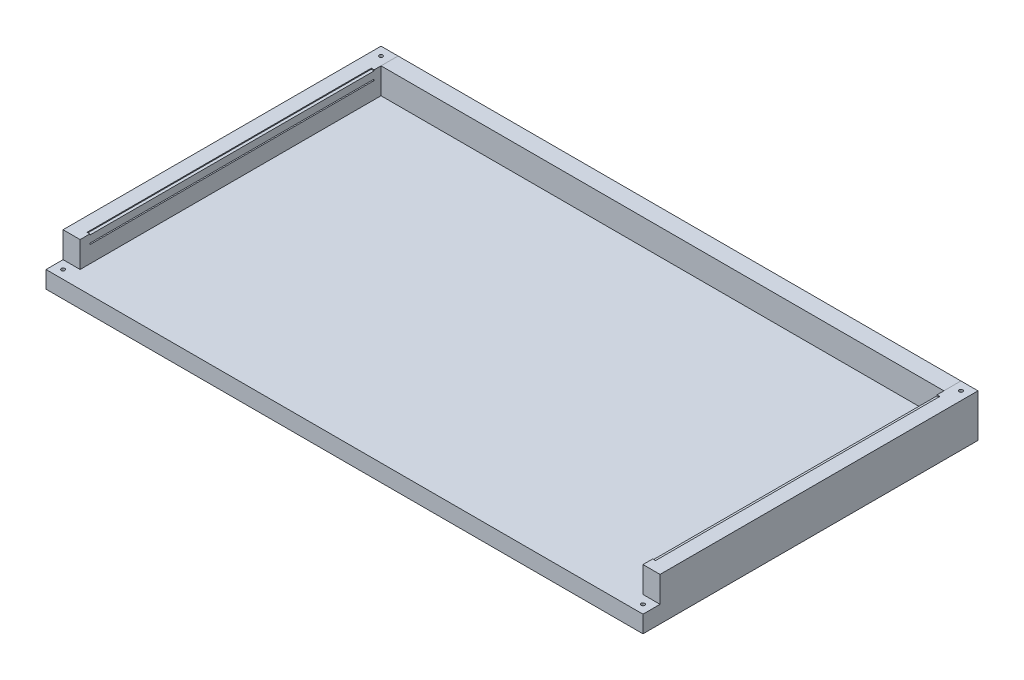
ISO-10303-21;
HEADER;
FILE_DESCRIPTION(('STEP AP214'),'2;1');
FILE_NAME('part.step','',(''),(''),'','','');
FILE_SCHEMA(('AUTOMOTIVE_DESIGN { 1 0 10303 214 1 1 1 1 }'));
ENDSEC;
DATA;
#1=APPLICATION_CONTEXT('core data for automotive mechanical design processes');
#2=APPLICATION_PROTOCOL_DEFINITION('international standard','automotive_design',2000,#1);
#3=PRODUCT_CONTEXT('',#1,'mechanical');
#4=PRODUCT('Part','Part','',(#3));
#5=PRODUCT_RELATED_PRODUCT_CATEGORY('part','',(#4));
#6=PRODUCT_DEFINITION_FORMATION('','',#4);
#7=PRODUCT_DEFINITION_CONTEXT('part definition',#1,'design');
#8=PRODUCT_DEFINITION('design','',#6,#7);
#9=PRODUCT_DEFINITION_SHAPE('','',#8);
#10=(LENGTH_UNIT() NAMED_UNIT(*) SI_UNIT(.MILLI.,.METRE.));
#11=(NAMED_UNIT(*) PLANE_ANGLE_UNIT() SI_UNIT($,.RADIAN.));
#12=(NAMED_UNIT(*) SI_UNIT($,.STERADIAN.) SOLID_ANGLE_UNIT());
#13=UNCERTAINTY_MEASURE_WITH_UNIT(LENGTH_MEASURE(1.E-05),#10,'distance_accuracy_value','');
#14=(GEOMETRIC_REPRESENTATION_CONTEXT(3) GLOBAL_UNCERTAINTY_ASSIGNED_CONTEXT((#13)) GLOBAL_UNIT_ASSIGNED_CONTEXT((#10,
#11,#12)) REPRESENTATION_CONTEXT('',''));
#15=CARTESIAN_POINT('',(0.,0.,0.));
#16=DIRECTION('',(0.,0.,1.));
#17=DIRECTION('',(1.,0.,0.));
#18=AXIS2_PLACEMENT_3D('',#15,#16,#17);
#19=CARTESIAN_POINT('',(-1050.,2132.1088823063,-499.25));
#20=DIRECTION('',(0.,0.,1.));
#21=DIRECTION('',(1.,0.,0.));
#22=AXIS2_PLACEMENT_3D('',#19,#20,#21);
#23=PLANE('',#22);
#24=DIRECTION('',(1.,0.,0.));
#25=VECTOR('',#24,1.);
#26=CARTESIAN_POINT('',(-1050.,151.2,-499.25));
#27=LINE('',#26,#25);
#28=CARTESIAN_POINT('',(-990.,151.2,-499.25));
#29=VERTEX_POINT('',#28);
#30=CARTESIAN_POINT('',(990.,151.2,-499.25));
#31=VERTEX_POINT('',#30);
#32=EDGE_CURVE('E52',#29,#31,#27,.T.);
#33=ORIENTED_EDGE('',*,*,#32,.F.);
#34=DIRECTION('',(0.,-1.,0.));
#35=VECTOR('',#34,1.);
#36=CARTESIAN_POINT('',(-990.,2132.1088823063,-499.25));
#37=LINE('',#36,#35);
#38=CARTESIAN_POINT('',(-990.,0.,-499.25));
#39=VERTEX_POINT('',#38);
#40=EDGE_CURVE('E80',#29,#39,#37,.T.);
#41=ORIENTED_EDGE('',*,*,#40,.T.);
#42=DIRECTION('',(-1.,0.,0.));
#43=VECTOR('',#42,1.);
#44=CARTESIAN_POINT('',(-1050.,0.,-499.25));
#45=LINE('',#44,#43);
#46=CARTESIAN_POINT('',(990.,0.,-499.25));
#47=VERTEX_POINT('',#46);
#48=EDGE_CURVE('E84',#47,#39,#45,.T.);
#49=ORIENTED_EDGE('',*,*,#48,.F.);
#50=DIRECTION('',(0.,-1.,0.));
#51=VECTOR('',#50,1.);
#52=CARTESIAN_POINT('',(990.,2132.1088823063,-499.25));
#53=LINE('',#52,#51);
#54=EDGE_CURVE('E107',#31,#47,#53,.T.);
#55=ORIENTED_EDGE('',*,*,#54,.F.);
#56=EDGE_LOOP('',(#33,#41,#49,#55));
#57=FACE_BOUND('',#56,.T.);
#58=ADVANCED_FACE('F44',(#57),#23,.T.);
#59=CARTESIAN_POINT('',(989.999999999996,2132.1088823063,559.250000000008));
#60=DIRECTION('',(1.,0.,0.));
#61=DIRECTION('',(0.,0.,-1.));
#62=AXIS2_PLACEMENT_3D('',#59,#60,#61);
#63=PLANE('',#62);
#64=DIRECTION('',(0.,0.,-1.));
#65=VECTOR('',#64,1.);
#66=CARTESIAN_POINT('',(989.999999999996,151.2,559.250000000008));
#67=LINE('',#66,#65);
#68=CARTESIAN_POINT('',(990.,151.2,-559.25));
#69=VERTEX_POINT('',#68);
#70=EDGE_CURVE('E58',#31,#69,#67,.T.);
#71=ORIENTED_EDGE('',*,*,#70,.F.);
#72=ORIENTED_EDGE('',*,*,#54,.T.);
#73=DIRECTION('',(0.,0.,1.));
#74=VECTOR('',#73,1.);
#75=CARTESIAN_POINT('',(989.999999999996,0.,559.250000000008));
#76=LINE('',#75,#74);
#77=CARTESIAN_POINT('',(990.,0.,-559.25));
#78=VERTEX_POINT('',#77);
#79=EDGE_CURVE('E89',#78,#47,#76,.T.);
#80=ORIENTED_EDGE('',*,*,#79,.F.);
#81=DIRECTION('',(0.,-1.,0.));
#82=VECTOR('',#81,1.);
#83=CARTESIAN_POINT('',(990.,2132.1088823063,-559.25));
#84=LINE('',#83,#82);
#85=EDGE_CURVE('E110',#69,#78,#84,.T.);
#86=ORIENTED_EDGE('',*,*,#85,.F.);
#87=EDGE_LOOP('',(#71,#72,#80,#86));
#88=FACE_BOUND('',#87,.T.);
#89=ADVANCED_FACE('F116',(#88),#63,.T.);
#90=CARTESIAN_POINT('',(-1050.,2132.1088823063,-559.25));
#91=DIRECTION('',(0.,0.,-1.));
#92=DIRECTION('',(-1.,0.,0.));
#93=AXIS2_PLACEMENT_3D('',#90,#91,#92);
#94=PLANE('',#93);
#95=DIRECTION('',(-1.,0.,0.));
#96=VECTOR('',#95,1.);
#97=CARTESIAN_POINT('',(-1050.,151.2,-559.25));
#98=LINE('',#97,#96);
#99=CARTESIAN_POINT('',(-990.,151.2,-559.25));
#100=VERTEX_POINT('',#99);
#101=EDGE_CURVE('E109',#69,#100,#98,.T.);
#102=ORIENTED_EDGE('',*,*,#101,.F.);
#103=ORIENTED_EDGE('',*,*,#85,.T.);
#104=DIRECTION('',(1.,0.,0.));
#105=VECTOR('',#104,1.);
#106=CARTESIAN_POINT('',(-1050.,0.,-559.25));
#107=LINE('',#106,#105);
#108=CARTESIAN_POINT('',(-990.,0.,-559.25));
#109=VERTEX_POINT('',#108);
#110=EDGE_CURVE('E97',#109,#78,#107,.T.);
#111=ORIENTED_EDGE('',*,*,#110,.F.);
#112=DIRECTION('',(0.,-1.,0.));
#113=VECTOR('',#112,1.);
#114=CARTESIAN_POINT('',(-990.,2132.1088823063,-559.25));
#115=LINE('',#114,#113);
#116=EDGE_CURVE('E88',#100,#109,#115,.T.);
#117=ORIENTED_EDGE('',*,*,#116,.F.);
#118=EDGE_LOOP('',(#102,#103,#111,#117));
#119=FACE_BOUND('',#118,.T.);
#120=ADVANCED_FACE('F114',(#119),#94,.T.);
#121=CARTESIAN_POINT('',(-990.,2132.1088823063,559.25));
#122=DIRECTION('',(-1.,0.,0.));
#123=DIRECTION('',(0.,0.,1.));
#124=AXIS2_PLACEMENT_3D('',#121,#122,#123);
#125=PLANE('',#124);
#126=DIRECTION('',(0.,0.,1.));
#127=VECTOR('',#126,1.);
#128=CARTESIAN_POINT('',(-990.,151.2,559.25));
#129=LINE('',#128,#127);
#130=EDGE_CURVE('E12',#100,#29,#129,.T.);
#131=ORIENTED_EDGE('',*,*,#130,.F.);
#132=ORIENTED_EDGE('',*,*,#116,.T.);
#133=DIRECTION('',(0.,0.,-1.));
#134=VECTOR('',#133,1.);
#135=CARTESIAN_POINT('',(-990.,0.,559.25));
#136=LINE('',#135,#134);
#137=EDGE_CURVE('E91',#39,#109,#136,.T.);
#138=ORIENTED_EDGE('',*,*,#137,.F.);
#139=ORIENTED_EDGE('',*,*,#40,.F.);
#140=EDGE_LOOP('',(#131,#132,#138,#139));
#141=FACE_BOUND('',#140,.T.);
#142=ADVANCED_FACE('F92',(#141),#125,.T.);
#143=CARTESIAN_POINT('',(0.,0.,0.));
#144=DIRECTION('',(0.,-1.,0.));
#145=DIRECTION('',(0.,0.,-1.));
#146=AXIS2_PLACEMENT_3D('',#143,#144,#145);
#147=PLANE('',#146);
#148=ORIENTED_EDGE('',*,*,#48,.T.);
#149=ORIENTED_EDGE('',*,*,#137,.T.);
#150=ORIENTED_EDGE('',*,*,#110,.T.);
#151=ORIENTED_EDGE('',*,*,#79,.T.);
#152=EDGE_LOOP('',(#148,#149,#150,#151));
#153=FACE_BOUND('',#152,.T.);
#154=ADVANCED_FACE('F99',(#153),#147,.T.);
#155=CARTESIAN_POINT('',(-1050.,151.2,559.25));
#156=DIRECTION('',(0.,-1.,0.));
#157=DIRECTION('',(0.,0.,-1.));
#158=AXIS2_PLACEMENT_3D('',#155,#156,#157);
#159=PLANE('',#158);
#160=ORIENTED_EDGE('',*,*,#32,.T.);
#161=ORIENTED_EDGE('',*,*,#70,.T.);
#162=ORIENTED_EDGE('',*,*,#101,.T.);
#163=ORIENTED_EDGE('',*,*,#130,.T.);
#164=EDGE_LOOP('',(#160,#161,#162,#163));
#165=FACE_BOUND('',#164,.T.);
#166=ADVANCED_FACE('F118',(#165),#159,.F.);
#167=CLOSED_SHELL('',(#58,#89,#120,#142,#154,#166));
#168=MANIFOLD_SOLID_BREP('B2',#167);
#169=CARTESIAN_POINT('',(0.,0.,559.25));
#170=DIRECTION('',(0.,0.,1.));
#171=DIRECTION('',(1.,0.,0.));
#172=AXIS2_PLACEMENT_3D('',#169,#170,#171);
#173=PLANE('',#172);
#174=DIRECTION('',(-1.,0.,0.));
#175=VECTOR('',#174,1.);
#176=CARTESIAN_POINT('',(-1050.,60.0000000000001,559.25));
#177=LINE('',#176,#175);
#178=CARTESIAN_POINT('',(1050.,60.0000000000001,559.25));
#179=VERTEX_POINT('',#178);
#180=CARTESIAN_POINT('',(990.,60.,559.25));
#181=VERTEX_POINT('',#180);
#182=EDGE_CURVE('E177',#179,#181,#177,.T.);
#183=ORIENTED_EDGE('',*,*,#182,.F.);
#184=DIRECTION('',(0.,1.,0.));
#185=VECTOR('',#184,1.);
#186=CARTESIAN_POINT('',(1050.,151.2,559.25));
#187=LINE('',#186,#185);
#188=CARTESIAN_POINT('',(1050.,151.2,559.25));
#189=VERTEX_POINT('',#188);
#190=EDGE_CURVE('E486',#179,#189,#187,.T.);
#191=ORIENTED_EDGE('',*,*,#190,.T.);
#192=DIRECTION('',(-1.,0.,0.));
#193=VECTOR('',#192,1.);
#194=CARTESIAN_POINT('',(1050.,151.2,559.25));
#195=LINE('',#194,#193);
#196=CARTESIAN_POINT('',(990.,151.2,559.25));
#197=VERTEX_POINT('',#196);
#198=EDGE_CURVE('E488',#189,#197,#195,.T.);
#199=ORIENTED_EDGE('',*,*,#198,.T.);
#200=DIRECTION('',(0.,-1.,0.));
#201=VECTOR('',#200,1.);
#202=CARTESIAN_POINT('',(990.,151.2,559.25));
#203=LINE('',#202,#201);
#204=EDGE_CURVE('E490',#197,#181,#203,.T.);
#205=ORIENTED_EDGE('',*,*,#204,.T.);
#206=EDGE_LOOP('',(#183,#191,#199,#205));
#207=FACE_BOUND('',#206,.T.);
#208=ADVANCED_FACE('F167',(#207),#173,.T.);
#209=CARTESIAN_POINT('',(1050.,151.2,559.25));
#210=DIRECTION('',(0.,-1.,0.));
#211=DIRECTION('',(0.,0.,-1.));
#212=AXIS2_PLACEMENT_3D('',#209,#210,#211);
#213=PLANE('',#212);
#214=CARTESIAN_POINT('',(1020.,151.2,-529.25));
#215=DIRECTION('',(0.,-1.,0.));
#216=DIRECTION('',(0.,0.,-1.));
#217=AXIS2_PLACEMENT_3D('',#214,#215,#216);
#218=CIRCLE('',#217,6.35000000000015);
#219=CARTESIAN_POINT('',(1020.,151.2,-535.6));
#220=VERTEX_POINT('',#219);
#221=EDGE_CURVE('E382',#220,#220,#218,.T.);
#222=ORIENTED_EDGE('',*,*,#221,.T.);
#223=EDGE_LOOP('',(#222));
#224=FACE_BOUND('',#223,.T.);
#225=DIRECTION('',(-1.,0.,0.));
#226=VECTOR('',#225,1.);
#227=CARTESIAN_POINT('',(1000.,151.2,-475.));
#228=LINE('',#227,#226);
#229=CARTESIAN_POINT('',(1000.,151.2,-475.));
#230=VERTEX_POINT('',#229);
#231=CARTESIAN_POINT('',(990.,151.2,-475.));
#232=VERTEX_POINT('',#231);
#233=EDGE_CURVE('E401',#230,#232,#228,.T.);
#234=ORIENTED_EDGE('',*,*,#233,.F.);
#235=DIRECTION('',(0.,0.,1.));
#236=VECTOR('',#235,1.);
#237=CARTESIAN_POINT('',(1000.,151.2,-475.));
#238=LINE('',#237,#236);
#239=CARTESIAN_POINT('',(1000.,151.2,525.));
#240=VERTEX_POINT('',#239);
#241=EDGE_CURVE('E419',#230,#240,#238,.T.);
#242=ORIENTED_EDGE('',*,*,#241,.T.);
#243=DIRECTION('',(-1.,0.,0.));
#244=VECTOR('',#243,1.);
#245=CARTESIAN_POINT('',(1000.,151.2,525.));
#246=LINE('',#245,#244);
#247=CARTESIAN_POINT('',(990.,151.2,525.));
#248=VERTEX_POINT('',#247);
#249=EDGE_CURVE('E394',#240,#248,#246,.T.);
#250=ORIENTED_EDGE('',*,*,#249,.T.);
#251=DIRECTION('',(0.,0.,-1.));
#252=VECTOR('',#251,1.);
#253=CARTESIAN_POINT('',(990.,151.2,559.25));
#254=LINE('',#253,#252);
#255=EDGE_CURVE('E528',#197,#248,#254,.T.);
#256=ORIENTED_EDGE('',*,*,#255,.F.);
#257=ORIENTED_EDGE('',*,*,#198,.F.);
#258=DIRECTION('',(0.,0.,-1.));
#259=VECTOR('',#258,1.);
#260=CARTESIAN_POINT('',(1050.,151.2,559.25));
#261=LINE('',#260,#259);
#262=CARTESIAN_POINT('',(1050.,151.2,-559.25));
#263=VERTEX_POINT('',#262);
#264=EDGE_CURVE('E531',#189,#263,#261,.T.);
#265=ORIENTED_EDGE('',*,*,#264,.T.);
#266=DIRECTION('',(-1.,0.,0.));
#267=VECTOR('',#266,1.);
#268=CARTESIAN_POINT('',(1050.,151.2,-559.25));
#269=LINE('',#268,#267);
#270=CARTESIAN_POINT('',(990.,151.2,-559.25));
#271=VERTEX_POINT('',#270);
#272=EDGE_CURVE('E498',#263,#271,#269,.T.);
#273=ORIENTED_EDGE('',*,*,#272,.T.);
#274=EDGE_CURVE('E527',#232,#271,#254,.T.);
#275=ORIENTED_EDGE('',*,*,#274,.F.);
#276=EDGE_LOOP('',(#234,#242,#250,#256,#257,#265,#273,#275));
#277=FACE_BOUND('',#276,.T.);
#278=ADVANCED_FACE('F586',(#224,#277),#213,.F.);
#279=CARTESIAN_POINT('',(990.,151.2,559.25));
#280=DIRECTION('',(1.,0.,0.));
#281=DIRECTION('',(0.,1.,0.));
#282=AXIS2_PLACEMENT_3D('',#279,#280,#281);
#283=PLANE('',#282);
#284=DIRECTION('',(0.,0.,-1.));
#285=VECTOR('',#284,1.);
#286=CARTESIAN_POINT('',(990.,118.5,559.25));
#287=LINE('',#286,#285);
#288=CARTESIAN_POINT('',(990.,118.5,525.));
#289=VERTEX_POINT('',#288);
#290=CARTESIAN_POINT('',(990.,118.5,-475.));
#291=VERTEX_POINT('',#290);
#292=EDGE_CURVE('E476',#289,#291,#287,.T.);
#293=ORIENTED_EDGE('',*,*,#292,.T.);
#294=DIRECTION('',(0.,1.,0.));
#295=VECTOR('',#294,1.);
#296=CARTESIAN_POINT('',(990.,151.2,-475.));
#297=LINE('',#296,#295);
#298=CARTESIAN_POINT('',(990.,122.9,-475.));
#299=VERTEX_POINT('',#298);
#300=EDGE_CURVE('E473',#291,#299,#297,.T.);
#301=ORIENTED_EDGE('',*,*,#300,.T.);
#302=DIRECTION('',(0.,0.,1.));
#303=VECTOR('',#302,1.);
#304=CARTESIAN_POINT('',(990.,122.9,559.25));
#305=LINE('',#304,#303);
#306=CARTESIAN_POINT('',(990.,122.9,525.));
#307=VERTEX_POINT('',#306);
#308=EDGE_CURVE('E479',#299,#307,#305,.T.);
#309=ORIENTED_EDGE('',*,*,#308,.T.);
#310=DIRECTION('',(0.,1.,0.));
#311=VECTOR('',#310,1.);
#312=CARTESIAN_POINT('',(990.,151.2,525.));
#313=LINE('',#312,#311);
#314=EDGE_CURVE('E471',#289,#307,#313,.T.);
#315=ORIENTED_EDGE('',*,*,#314,.F.);
#316=EDGE_LOOP('',(#293,#301,#309,#315));
#317=FACE_BOUND('',#316,.T.);
#318=DIRECTION('',(0.,-1.,0.));
#319=VECTOR('',#318,1.);
#320=CARTESIAN_POINT('',(990.,151.2,-475.));
#321=LINE('',#320,#319);
#322=CARTESIAN_POINT('',(990.,147.9,-475.));
#323=VERTEX_POINT('',#322);
#324=EDGE_CURVE('E469',#232,#323,#321,.T.);
#325=ORIENTED_EDGE('',*,*,#324,.F.);
#326=ORIENTED_EDGE('',*,*,#274,.T.);
#327=DIRECTION('',(0.,-1.,0.));
#328=VECTOR('',#327,1.);
#329=CARTESIAN_POINT('',(990.,151.2,-559.25));
#330=LINE('',#329,#328);
#331=CARTESIAN_POINT('',(990.,60.,-559.25));
#332=VERTEX_POINT('',#331);
#333=EDGE_CURVE('E501',#271,#332,#330,.T.);
#334=ORIENTED_EDGE('',*,*,#333,.T.);
#335=DIRECTION('',(0.,0.,-1.));
#336=VECTOR('',#335,1.);
#337=CARTESIAN_POINT('',(990.,60.,559.25));
#338=LINE('',#337,#336);
#339=EDGE_CURVE('E524',#181,#332,#338,.T.);
#340=ORIENTED_EDGE('',*,*,#339,.F.);
#341=ORIENTED_EDGE('',*,*,#204,.F.);
#342=ORIENTED_EDGE('',*,*,#255,.T.);
#343=DIRECTION('',(0.,-1.,0.));
#344=VECTOR('',#343,1.);
#345=CARTESIAN_POINT('',(990.,151.2,525.));
#346=LINE('',#345,#344);
#347=CARTESIAN_POINT('',(990.,147.9,525.));
#348=VERTEX_POINT('',#347);
#349=EDGE_CURVE('E464',#248,#348,#346,.T.);
#350=ORIENTED_EDGE('',*,*,#349,.T.);
#351=DIRECTION('',(0.,0.,-1.));
#352=VECTOR('',#351,1.);
#353=CARTESIAN_POINT('',(990.,147.9,559.25));
#354=LINE('',#353,#352);
#355=EDGE_CURVE('E482',#348,#323,#354,.T.);
#356=ORIENTED_EDGE('',*,*,#355,.T.);
#357=EDGE_LOOP('',(#325,#326,#334,#340,#341,#342,#350,#356));
#358=FACE_BOUND('',#357,.T.);
#359=ADVANCED_FACE('F592',(#317,#358),#283,.F.);
#360=CARTESIAN_POINT('',(-990.,151.2,559.25));
#361=DIRECTION('',(-1.,0.,0.));
#362=DIRECTION('',(0.,-1.,0.));
#363=AXIS2_PLACEMENT_3D('',#360,#361,#362);
#364=PLANE('',#363);
#365=DIRECTION('',(0.,0.,-1.));
#366=VECTOR('',#365,1.);
#367=CARTESIAN_POINT('',(-990.,122.9,559.25));
#368=LINE('',#367,#366);
#369=CARTESIAN_POINT('',(-990.,122.9,525.));
#370=VERTEX_POINT('',#369);
#371=CARTESIAN_POINT('',(-990.,122.9,-475.));
#372=VERTEX_POINT('',#371);
#373=EDGE_CURVE('E544',#370,#372,#368,.T.);
#374=ORIENTED_EDGE('',*,*,#373,.T.);
#375=DIRECTION('',(0.,-1.,0.));
#376=VECTOR('',#375,1.);
#377=CARTESIAN_POINT('',(-990.,151.2,-475.));
#378=LINE('',#377,#376);
#379=CARTESIAN_POINT('',(-990.,118.5,-475.));
#380=VERTEX_POINT('',#379);
#381=EDGE_CURVE('E546',#372,#380,#378,.T.);
#382=ORIENTED_EDGE('',*,*,#381,.T.);
#383=DIRECTION('',(0.,0.,1.));
#384=VECTOR('',#383,1.);
#385=CARTESIAN_POINT('',(-990.,118.5,559.25));
#386=LINE('',#385,#384);
#387=CARTESIAN_POINT('',(-990.,118.5,525.));
#388=VERTEX_POINT('',#387);
#389=EDGE_CURVE('E541',#380,#388,#386,.T.);
#390=ORIENTED_EDGE('',*,*,#389,.T.);
#391=DIRECTION('',(0.,-1.,0.));
#392=VECTOR('',#391,1.);
#393=CARTESIAN_POINT('',(-990.,151.2,525.));
#394=LINE('',#393,#392);
#395=EDGE_CURVE('E539',#370,#388,#394,.T.);
#396=ORIENTED_EDGE('',*,*,#395,.F.);
#397=EDGE_LOOP('',(#374,#382,#390,#396));
#398=FACE_BOUND('',#397,.T.);
#399=DIRECTION('',(0.,1.,0.));
#400=VECTOR('',#399,1.);
#401=CARTESIAN_POINT('',(-990.,151.2,-475.));
#402=LINE('',#401,#400);
#403=CARTESIAN_POINT('',(-990.,147.9,-475.));
#404=VERTEX_POINT('',#403);
#405=CARTESIAN_POINT('',(-990.,151.2,-475.));
#406=VERTEX_POINT('',#405);
#407=EDGE_CURVE('E467',#404,#406,#402,.T.);
#408=ORIENTED_EDGE('',*,*,#407,.F.);
#409=DIRECTION('',(0.,0.,1.));
#410=VECTOR('',#409,1.);
#411=CARTESIAN_POINT('',(-990.,147.9,559.25));
#412=LINE('',#411,#410);
#413=CARTESIAN_POINT('',(-990.,147.9,525.));
#414=VERTEX_POINT('',#413);
#415=EDGE_CURVE('E171',#404,#414,#412,.T.);
#416=ORIENTED_EDGE('',*,*,#415,.T.);
#417=DIRECTION('',(0.,1.,0.));
#418=VECTOR('',#417,1.);
#419=CARTESIAN_POINT('',(-990.,151.2,525.));
#420=LINE('',#419,#418);
#421=CARTESIAN_POINT('',(-990.,151.2,525.));
#422=VERTEX_POINT('',#421);
#423=EDGE_CURVE('E418',#414,#422,#420,.T.);
#424=ORIENTED_EDGE('',*,*,#423,.T.);
#425=DIRECTION('',(0.,0.,-1.));
#426=VECTOR('',#425,1.);
#427=CARTESIAN_POINT('',(-990.,151.2,559.25));
#428=LINE('',#427,#426);
#429=CARTESIAN_POINT('',(-990.,151.2,559.25));
#430=VERTEX_POINT('',#429);
#431=EDGE_CURVE('E518',#430,#422,#428,.T.);
#432=ORIENTED_EDGE('',*,*,#431,.F.);
#433=DIRECTION('',(0.,1.,0.));
#434=VECTOR('',#433,1.);
#435=CARTESIAN_POINT('',(-990.,151.2,559.25));
#436=LINE('',#435,#434);
#437=CARTESIAN_POINT('',(-990.,60.,559.25));
#438=VERTEX_POINT('',#437);
#439=EDGE_CURVE('E492',#438,#430,#436,.T.);
#440=ORIENTED_EDGE('',*,*,#439,.F.);
#441=DIRECTION('',(0.,0.,-1.));
#442=VECTOR('',#441,1.);
#443=CARTESIAN_POINT('',(-990.,60.,559.25));
#444=LINE('',#443,#442);
#445=CARTESIAN_POINT('',(-990.,60.,-559.25));
#446=VERTEX_POINT('',#445);
#447=EDGE_CURVE('E521',#438,#446,#444,.T.);
#448=ORIENTED_EDGE('',*,*,#447,.T.);
#449=DIRECTION('',(0.,1.,0.));
#450=VECTOR('',#449,1.);
#451=CARTESIAN_POINT('',(-990.,151.2,-559.25));
#452=LINE('',#451,#450);
#453=CARTESIAN_POINT('',(-990.,151.2,-559.25));
#454=VERTEX_POINT('',#453);
#455=EDGE_CURVE('E505',#446,#454,#452,.T.);
#456=ORIENTED_EDGE('',*,*,#455,.T.);
#457=EDGE_CURVE('E517',#406,#454,#428,.T.);
#458=ORIENTED_EDGE('',*,*,#457,.F.);
#459=EDGE_LOOP('',(#408,#416,#424,#432,#440,#448,#456,#458));
#460=FACE_BOUND('',#459,.T.);
#461=ADVANCED_FACE('F552',(#398,#460),#364,.F.);
#462=CARTESIAN_POINT('',(-1050.,151.2,559.25));
#463=DIRECTION('',(0.,-1.,0.));
#464=DIRECTION('',(0.,0.,-1.));
#465=AXIS2_PLACEMENT_3D('',#462,#463,#464);
#466=PLANE('',#465);
#467=CARTESIAN_POINT('',(-1020.,151.2,-529.25));
#468=DIRECTION('',(0.,-1.,0.));
#469=DIRECTION('',(0.,0.,-1.));
#470=AXIS2_PLACEMENT_3D('',#467,#468,#469);
#471=CIRCLE('',#470,6.35000000000015);
#472=CARTESIAN_POINT('',(-1020.,151.2,-535.6));
#473=VERTEX_POINT('',#472);
#474=EDGE_CURVE('E377',#473,#473,#471,.T.);
#475=ORIENTED_EDGE('',*,*,#474,.T.);
#476=EDGE_LOOP('',(#475));
#477=FACE_BOUND('',#476,.T.);
#478=DIRECTION('',(-1.,0.,0.));
#479=VECTOR('',#478,1.);
#480=CARTESIAN_POINT('',(-1050.,151.2,-475.));
#481=LINE('',#480,#479);
#482=CARTESIAN_POINT('',(-1000.,151.2,-475.));
#483=VERTEX_POINT('',#482);
#484=EDGE_CURVE('E537',#406,#483,#481,.T.);
#485=ORIENTED_EDGE('',*,*,#484,.F.);
#486=ORIENTED_EDGE('',*,*,#457,.T.);
#487=DIRECTION('',(-1.,0.,0.));
#488=VECTOR('',#487,1.);
#489=CARTESIAN_POINT('',(-1050.,151.2,-559.25));
#490=LINE('',#489,#488);
#491=CARTESIAN_POINT('',(-1050.,151.2,-559.25));
#492=VERTEX_POINT('',#491);
#493=EDGE_CURVE('E508',#454,#492,#490,.T.);
#494=ORIENTED_EDGE('',*,*,#493,.T.);
#495=DIRECTION('',(0.,0.,-1.));
#496=VECTOR('',#495,1.);
#497=CARTESIAN_POINT('',(-1050.,151.2,559.25));
#498=LINE('',#497,#496);
#499=CARTESIAN_POINT('',(-1050.,151.2,559.25));
#500=VERTEX_POINT('',#499);
#501=EDGE_CURVE('E514',#500,#492,#498,.T.);
#502=ORIENTED_EDGE('',*,*,#501,.F.);
#503=DIRECTION('',(-1.,0.,0.));
#504=VECTOR('',#503,1.);
#505=CARTESIAN_POINT('',(-1050.,151.2,559.25));
#506=LINE('',#505,#504);
#507=EDGE_CURVE('E494',#430,#500,#506,.T.);
#508=ORIENTED_EDGE('',*,*,#507,.F.);
#509=ORIENTED_EDGE('',*,*,#431,.T.);
#510=DIRECTION('',(-1.,0.,0.));
#511=VECTOR('',#510,1.);
#512=CARTESIAN_POINT('',(-1050.,151.2,525.));
#513=LINE('',#512,#511);
#514=CARTESIAN_POINT('',(-1000.,151.2,525.));
#515=VERTEX_POINT('',#514);
#516=EDGE_CURVE('E534',#422,#515,#513,.T.);
#517=ORIENTED_EDGE('',*,*,#516,.T.);
#518=DIRECTION('',(0.,0.,1.));
#519=VECTOR('',#518,1.);
#520=CARTESIAN_POINT('',(-1000.,151.2,-475.));
#521=LINE('',#520,#519);
#522=EDGE_CURVE('E415',#483,#515,#521,.T.);
#523=ORIENTED_EDGE('',*,*,#522,.F.);
#524=EDGE_LOOP('',(#485,#486,#494,#502,#508,#509,#517,#523));
#525=FACE_BOUND('',#524,.T.);
#526=ADVANCED_FACE('F567',(#477,#525),#466,.F.);
#527=CARTESIAN_POINT('',(1050.,151.2,559.25));
#528=DIRECTION('',(-1.,0.,0.));
#529=DIRECTION('',(0.,-1.,0.));
#530=AXIS2_PLACEMENT_3D('',#527,#528,#529);
#531=PLANE('',#530);
#532=DIRECTION('',(0.,1.,0.));
#533=VECTOR('',#532,1.);
#534=CARTESIAN_POINT('',(1050.,151.2,-559.25));
#535=LINE('',#534,#533);
#536=CARTESIAN_POINT('',(1050.,0.,-559.25));
#537=VERTEX_POINT('',#536);
#538=EDGE_CURVE('E485',#537,#263,#535,.T.);
#539=ORIENTED_EDGE('',*,*,#538,.T.);
#540=ORIENTED_EDGE('',*,*,#264,.F.);
#541=ORIENTED_EDGE('',*,*,#190,.F.);
#542=DIRECTION('',(0.,0.,-1.));
#543=VECTOR('',#542,1.);
#544=CARTESIAN_POINT('',(1050.,60.0000000000001,559.25));
#545=LINE('',#544,#543);
#546=CARTESIAN_POINT('',(1050.,60.0000000000001,619.25));
#547=VERTEX_POINT('',#546);
#548=EDGE_CURVE('E359',#547,#179,#545,.T.);
#549=ORIENTED_EDGE('',*,*,#548,.F.);
#550=DIRECTION('',(0.,-1.,0.));
#551=VECTOR('',#550,1.);
#552=CARTESIAN_POINT('',(1050.,2160.85696800139,619.25));
#553=LINE('',#552,#551);
#554=CARTESIAN_POINT('',(1050.,0.,619.25));
#555=VERTEX_POINT('',#554);
#556=EDGE_CURVE('E357',#547,#555,#553,.T.);
#557=ORIENTED_EDGE('',*,*,#556,.T.);
#558=DIRECTION('',(0.,0.,-1.));
#559=VECTOR('',#558,1.);
#560=CARTESIAN_POINT('',(1050.,0.,559.25));
#561=LINE('',#560,#559);
#562=EDGE_CURVE('E341',#555,#537,#561,.T.);
#563=ORIENTED_EDGE('',*,*,#562,.T.);
#564=EDGE_LOOP('',(#539,#540,#541,#549,#557,#563));
#565=FACE_BOUND('',#564,.T.);
#566=ADVANCED_FACE('F169',(#565),#531,.F.);
#567=CARTESIAN_POINT('',(-990.,60.,559.25));
#568=DIRECTION('',(0.,-1.,0.));
#569=DIRECTION('',(0.,0.,-1.));
#570=AXIS2_PLACEMENT_3D('',#567,#568,#569);
#571=PLANE('',#570);
#572=CARTESIAN_POINT('',(-1020.,60.,589.25));
#573=DIRECTION('',(0.,-1.,0.));
#574=DIRECTION('',(0.,0.,-1.));
#575=AXIS2_PLACEMENT_3D('',#572,#573,#574);
#576=CIRCLE('',#575,6.35000000000015);
#577=CARTESIAN_POINT('',(-1020.,60.,582.9));
#578=VERTEX_POINT('',#577);
#579=EDGE_CURVE('E367',#578,#578,#576,.T.);
#580=ORIENTED_EDGE('',*,*,#579,.T.);
#581=EDGE_LOOP('',(#580));
#582=FACE_BOUND('',#581,.T.);
#583=CARTESIAN_POINT('',(1020.,60.,589.25));
#584=DIRECTION('',(0.,-1.,0.));
#585=DIRECTION('',(0.,0.,-1.));
#586=AXIS2_PLACEMENT_3D('',#583,#584,#585);
#587=CIRCLE('',#586,6.35000000000015);
#588=CARTESIAN_POINT('',(1020.,60.,582.9));
#589=VERTEX_POINT('',#588);
#590=EDGE_CURVE('E622',#589,#589,#587,.T.);
#591=ORIENTED_EDGE('',*,*,#590,.T.);
#592=EDGE_LOOP('',(#591));
#593=FACE_BOUND('',#592,.T.);
#594=DIRECTION('',(-1.,0.,0.));
#595=VECTOR('',#594,1.);
#596=CARTESIAN_POINT('',(-990.,60.,-559.25));
#597=LINE('',#596,#595);
#598=EDGE_CURVE('E503',#332,#446,#597,.T.);
#599=ORIENTED_EDGE('',*,*,#598,.T.);
#600=ORIENTED_EDGE('',*,*,#447,.F.);
#601=CARTESIAN_POINT('',(-1050.,60.0000000000001,559.25));
#602=VERTEX_POINT('',#601);
#603=EDGE_CURVE('E42',#438,#602,#177,.T.);
#604=ORIENTED_EDGE('',*,*,#603,.T.);
#605=DIRECTION('',(0.,0.,1.));
#606=VECTOR('',#605,1.);
#607=CARTESIAN_POINT('',(-1050.,60.0000000000001,559.25));
#608=LINE('',#607,#606);
#609=CARTESIAN_POINT('',(-1050.,60.0000000000001,619.25));
#610=VERTEX_POINT('',#609);
#611=EDGE_CURVE('E619',#602,#610,#608,.T.);
#612=ORIENTED_EDGE('',*,*,#611,.T.);
#613=DIRECTION('',(1.,0.,0.));
#614=VECTOR('',#613,1.);
#615=CARTESIAN_POINT('',(-1050.,60.0000000000001,619.25));
#616=LINE('',#615,#614);
#617=EDGE_CURVE('E374',#610,#547,#616,.T.);
#618=ORIENTED_EDGE('',*,*,#617,.T.);
#619=ORIENTED_EDGE('',*,*,#548,.T.);
#620=ORIENTED_EDGE('',*,*,#182,.T.);
#621=ORIENTED_EDGE('',*,*,#339,.T.);
#622=EDGE_LOOP('',(#599,#600,#604,#612,#618,#619,#620,#621));
#623=FACE_BOUND('',#622,.T.);
#624=ADVANCED_FACE('F612',(#582,#593,#623),#571,.F.);
#625=CARTESIAN_POINT('',(-1050.,151.2,559.25));
#626=DIRECTION('',(1.,0.,0.));
#627=DIRECTION('',(0.,1.,0.));
#628=AXIS2_PLACEMENT_3D('',#625,#626,#627);
#629=PLANE('',#628);
#630=DIRECTION('',(0.,-1.,0.));
#631=VECTOR('',#630,1.);
#632=CARTESIAN_POINT('',(-1050.,151.2,-559.25));
#633=LINE('',#632,#631);
#634=CARTESIAN_POINT('',(-1050.,0.,-559.25));
#635=VERTEX_POINT('',#634);
#636=EDGE_CURVE('E510',#492,#635,#633,.T.);
#637=ORIENTED_EDGE('',*,*,#636,.T.);
#638=DIRECTION('',(0.,0.,-1.));
#639=VECTOR('',#638,1.);
#640=CARTESIAN_POINT('',(-1050.,0.,559.25));
#641=LINE('',#640,#639);
#642=CARTESIAN_POINT('',(-1050.,0.,619.25));
#643=VERTEX_POINT('',#642);
#644=EDGE_CURVE('E352',#643,#635,#641,.T.);
#645=ORIENTED_EDGE('',*,*,#644,.F.);
#646=DIRECTION('',(0.,-1.,0.));
#647=VECTOR('',#646,1.);
#648=CARTESIAN_POINT('',(-1050.,2160.85696800139,619.25));
#649=LINE('',#648,#647);
#650=EDGE_CURVE('E362',#610,#643,#649,.T.);
#651=ORIENTED_EDGE('',*,*,#650,.F.);
#652=ORIENTED_EDGE('',*,*,#611,.F.);
#653=DIRECTION('',(0.,-1.,0.));
#654=VECTOR('',#653,1.);
#655=CARTESIAN_POINT('',(-1050.,151.2,559.25));
#656=LINE('',#655,#654);
#657=EDGE_CURVE('E353',#500,#602,#656,.T.);
#658=ORIENTED_EDGE('',*,*,#657,.F.);
#659=ORIENTED_EDGE('',*,*,#501,.T.);
#660=EDGE_LOOP('',(#637,#645,#651,#652,#658,#659));
#661=FACE_BOUND('',#660,.T.);
#662=ADVANCED_FACE('F604',(#661),#629,.F.);
#663=CARTESIAN_POINT('',(-1050.,0.,559.25));
#664=DIRECTION('',(0.,1.,0.));
#665=DIRECTION('',(0.,0.,1.));
#666=AXIS2_PLACEMENT_3D('',#663,#664,#665);
#667=PLANE('',#666);
#668=CARTESIAN_POINT('',(-1020.,0.,589.25));
#669=DIRECTION('',(0.,1.,0.));
#670=DIRECTION('',(0.,0.,1.));
#671=AXIS2_PLACEMENT_3D('',#668,#669,#670);
#672=CIRCLE('',#671,6.35000000000015);
#673=CARTESIAN_POINT('',(-1020.,0.,595.6));
#674=VERTEX_POINT('',#673);
#675=EDGE_CURVE('E370',#674,#674,#672,.T.);
#676=ORIENTED_EDGE('',*,*,#675,.T.);
#677=EDGE_LOOP('',(#676));
#678=FACE_BOUND('',#677,.T.);
#679=CARTESIAN_POINT('',(1020.,0.,589.25));
#680=DIRECTION('',(0.,1.,0.));
#681=DIRECTION('',(0.,0.,1.));
#682=AXIS2_PLACEMENT_3D('',#679,#680,#681);
#683=CIRCLE('',#682,6.35000000000015);
#684=CARTESIAN_POINT('',(1020.,0.,595.6));
#685=VERTEX_POINT('',#684);
#686=EDGE_CURVE('E625',#685,#685,#683,.T.);
#687=ORIENTED_EDGE('',*,*,#686,.T.);
#688=EDGE_LOOP('',(#687));
#689=FACE_BOUND('',#688,.T.);
#690=CARTESIAN_POINT('',(1020.,0.,-529.25));
#691=DIRECTION('',(0.,-1.,0.));
#692=DIRECTION('',(0.,0.,-1.));
#693=AXIS2_PLACEMENT_3D('',#690,#691,#692);
#694=CIRCLE('',#693,6.35000000000015);
#695=CARTESIAN_POINT('',(1020.,0.,-535.6));
#696=VERTEX_POINT('',#695);
#697=EDGE_CURVE('E378',#696,#696,#694,.T.);
#698=ORIENTED_EDGE('',*,*,#697,.F.);
#699=EDGE_LOOP('',(#698));
#700=FACE_BOUND('',#699,.T.);
#701=CARTESIAN_POINT('',(-1020.,0.,-529.25));
#702=DIRECTION('',(0.,-1.,0.));
#703=DIRECTION('',(0.,0.,-1.));
#704=AXIS2_PLACEMENT_3D('',#701,#702,#703);
#705=CIRCLE('',#704,6.35000000000015);
#706=CARTESIAN_POINT('',(-1020.,0.,-535.6));
#707=VERTEX_POINT('',#706);
#708=EDGE_CURVE('E385',#707,#707,#705,.T.);
#709=ORIENTED_EDGE('',*,*,#708,.F.);
#710=EDGE_LOOP('',(#709));
#711=FACE_BOUND('',#710,.T.);
#712=DIRECTION('',(1.,0.,0.));
#713=VECTOR('',#712,1.);
#714=CARTESIAN_POINT('',(-1050.,0.,-559.25));
#715=LINE('',#714,#713);
#716=EDGE_CURVE('E348',#635,#537,#715,.T.);
#717=ORIENTED_EDGE('',*,*,#716,.T.);
#718=ORIENTED_EDGE('',*,*,#562,.F.);
#719=DIRECTION('',(-1.,0.,0.));
#720=VECTOR('',#719,1.);
#721=CARTESIAN_POINT('',(-1050.,0.,619.25));
#722=LINE('',#721,#720);
#723=EDGE_CURVE('E346',#555,#643,#722,.T.);
#724=ORIENTED_EDGE('',*,*,#723,.T.);
#725=ORIENTED_EDGE('',*,*,#644,.T.);
#726=EDGE_LOOP('',(#717,#718,#724,#725));
#727=FACE_BOUND('',#726,.T.);
#728=ADVANCED_FACE('F343',(#678,#689,#700,#711,#727),#667,.F.);
#729=ORIENTED_EDGE('',*,*,#603,.F.);
#730=ORIENTED_EDGE('',*,*,#439,.T.);
#731=ORIENTED_EDGE('',*,*,#507,.T.);
#732=ORIENTED_EDGE('',*,*,#657,.T.);
#733=EDGE_LOOP('',(#729,#730,#731,#732));
#734=FACE_BOUND('',#733,.T.);
#735=ADVANCED_FACE('F588',(#734),#173,.T.);
#736=CARTESIAN_POINT('',(0.,0.,-559.25));
#737=DIRECTION('',(0.,0.,1.));
#738=DIRECTION('',(1.,0.,0.));
#739=AXIS2_PLACEMENT_3D('',#736,#737,#738);
#740=PLANE('',#739);
#741=ORIENTED_EDGE('',*,*,#538,.F.);
#742=ORIENTED_EDGE('',*,*,#716,.F.);
#743=ORIENTED_EDGE('',*,*,#636,.F.);
#744=ORIENTED_EDGE('',*,*,#493,.F.);
#745=ORIENTED_EDGE('',*,*,#455,.F.);
#746=ORIENTED_EDGE('',*,*,#598,.F.);
#747=ORIENTED_EDGE('',*,*,#333,.F.);
#748=ORIENTED_EDGE('',*,*,#272,.F.);
#749=EDGE_LOOP('',(#741,#742,#743,#744,#745,#746,#747,#748));
#750=FACE_BOUND('',#749,.T.);
#751=ADVANCED_FACE('F579',(#750),#740,.F.);
#752=CARTESIAN_POINT('',(0.,0.,-475.));
#753=DIRECTION('',(0.,0.,1.));
#754=DIRECTION('',(1.,0.,0.));
#755=AXIS2_PLACEMENT_3D('',#752,#753,#754);
#756=PLANE('',#755);
#757=ORIENTED_EDGE('',*,*,#407,.T.);
#758=ORIENTED_EDGE('',*,*,#484,.T.);
#759=DIRECTION('',(0.,-1.,0.));
#760=VECTOR('',#759,1.);
#761=CARTESIAN_POINT('',(-1000.,151.2,-475.));
#762=LINE('',#761,#760);
#763=CARTESIAN_POINT('',(-1000.,147.9,-475.));
#764=VERTEX_POINT('',#763);
#765=EDGE_CURVE('E390',#483,#764,#762,.T.);
#766=ORIENTED_EDGE('',*,*,#765,.T.);
#767=DIRECTION('',(1.,0.,0.));
#768=VECTOR('',#767,1.);
#769=CARTESIAN_POINT('',(-1000.,147.9,-475.));
#770=LINE('',#769,#768);
#771=EDGE_CURVE('E395',#764,#404,#770,.T.);
#772=ORIENTED_EDGE('',*,*,#771,.T.);
#773=EDGE_LOOP('',(#757,#758,#766,#772));
#774=FACE_BOUND('',#773,.T.);
#775=ADVANCED_FACE('F560',(#774),#756,.T.);
#776=CARTESIAN_POINT('',(0.,0.,525.));
#777=DIRECTION('',(0.,0.,1.));
#778=DIRECTION('',(1.,0.,0.));
#779=AXIS2_PLACEMENT_3D('',#776,#777,#778);
#780=PLANE('',#779);
#781=DIRECTION('',(1.,0.,0.));
#782=VECTOR('',#781,1.);
#783=CARTESIAN_POINT('',(-1000.,147.9,525.));
#784=LINE('',#783,#782);
#785=CARTESIAN_POINT('',(-1000.,147.9,525.));
#786=VERTEX_POINT('',#785);
#787=EDGE_CURVE('E408',#786,#414,#784,.T.);
#788=ORIENTED_EDGE('',*,*,#787,.F.);
#789=DIRECTION('',(0.,-1.,0.));
#790=VECTOR('',#789,1.);
#791=CARTESIAN_POINT('',(-1000.,151.2,525.));
#792=LINE('',#791,#790);
#793=EDGE_CURVE('E404',#515,#786,#792,.T.);
#794=ORIENTED_EDGE('',*,*,#793,.F.);
#795=ORIENTED_EDGE('',*,*,#516,.F.);
#796=ORIENTED_EDGE('',*,*,#423,.F.);
#797=EDGE_LOOP('',(#788,#794,#795,#796));
#798=FACE_BOUND('',#797,.T.);
#799=ADVANCED_FACE('F570',(#798),#780,.F.);
#800=CARTESIAN_POINT('',(-1000.,151.2,-475.));
#801=DIRECTION('',(-1.,0.,0.));
#802=DIRECTION('',(0.,0.,1.));
#803=AXIS2_PLACEMENT_3D('',#800,#801,#802);
#804=PLANE('',#803);
#805=ORIENTED_EDGE('',*,*,#793,.T.);
#806=DIRECTION('',(0.,0.,1.));
#807=VECTOR('',#806,1.);
#808=CARTESIAN_POINT('',(-1000.,147.9,-475.));
#809=LINE('',#808,#807);
#810=EDGE_CURVE('E403',#764,#786,#809,.T.);
#811=ORIENTED_EDGE('',*,*,#810,.F.);
#812=ORIENTED_EDGE('',*,*,#765,.F.);
#813=ORIENTED_EDGE('',*,*,#522,.T.);
#814=EDGE_LOOP('',(#805,#811,#812,#813));
#815=FACE_BOUND('',#814,.T.);
#816=ADVANCED_FACE('F565',(#815),#804,.F.);
#817=CARTESIAN_POINT('',(-1000.,147.9,-475.));
#818=DIRECTION('',(0.,-1.,0.));
#819=DIRECTION('',(0.,0.,-1.));
#820=AXIS2_PLACEMENT_3D('',#817,#818,#819);
#821=PLANE('',#820);
#822=ORIENTED_EDGE('',*,*,#771,.F.);
#823=ORIENTED_EDGE('',*,*,#810,.T.);
#824=ORIENTED_EDGE('',*,*,#787,.T.);
#825=ORIENTED_EDGE('',*,*,#415,.F.);
#826=EDGE_LOOP('',(#822,#823,#824,#825));
#827=FACE_BOUND('',#826,.T.);
#828=ADVANCED_FACE('F557',(#827),#821,.F.);
#829=CARTESIAN_POINT('',(-1000.,118.5,-475.));
#830=DIRECTION('',(-1.,0.,0.));
#831=DIRECTION('',(0.,0.,1.));
#832=AXIS2_PLACEMENT_3D('',#829,#830,#831);
#833=PLANE('',#832);
#834=DIRECTION('',(0.,-1.,0.));
#835=VECTOR('',#834,1.);
#836=CARTESIAN_POINT('',(-1000.,118.5,525.));
#837=LINE('',#836,#835);
#838=CARTESIAN_POINT('',(-1000.,122.9,525.));
#839=VERTEX_POINT('',#838);
#840=CARTESIAN_POINT('',(-1000.,118.5,525.));
#841=VERTEX_POINT('',#840);
#842=EDGE_CURVE('E381',#839,#841,#837,.T.);
#843=ORIENTED_EDGE('',*,*,#842,.T.);
#844=DIRECTION('',(0.,0.,1.));
#845=VECTOR('',#844,1.);
#846=CARTESIAN_POINT('',(-1000.,118.5,-475.));
#847=LINE('',#846,#845);
#848=CARTESIAN_POINT('',(-1000.,118.5,-475.));
#849=VERTEX_POINT('',#848);
#850=EDGE_CURVE('E441',#849,#841,#847,.T.);
#851=ORIENTED_EDGE('',*,*,#850,.F.);
#852=DIRECTION('',(0.,-1.,0.));
#853=VECTOR('',#852,1.);
#854=CARTESIAN_POINT('',(-1000.,118.5,-475.));
#855=LINE('',#854,#853);
#856=CARTESIAN_POINT('',(-1000.,122.9,-475.));
#857=VERTEX_POINT('',#856);
#858=EDGE_CURVE('E426',#857,#849,#855,.T.);
#859=ORIENTED_EDGE('',*,*,#858,.F.);
#860=DIRECTION('',(0.,0.,1.));
#861=VECTOR('',#860,1.);
#862=CARTESIAN_POINT('',(-1000.,122.9,-475.));
#863=LINE('',#862,#861);
#864=EDGE_CURVE('E407',#857,#839,#863,.T.);
#865=ORIENTED_EDGE('',*,*,#864,.T.);
#866=EDGE_LOOP('',(#843,#851,#859,#865));
#867=FACE_BOUND('',#866,.T.);
#868=ADVANCED_FACE('F701',(#867),#833,.F.);
#869=CARTESIAN_POINT('',(0.,0.,525.));
#870=DIRECTION('',(0.,0.,-1.));
#871=DIRECTION('',(-1.,0.,0.));
#872=AXIS2_PLACEMENT_3D('',#869,#870,#871);
#873=PLANE('',#872);
#874=ORIENTED_EDGE('',*,*,#395,.T.);
#875=DIRECTION('',(1.,0.,0.));
#876=VECTOR('',#875,1.);
#877=CARTESIAN_POINT('',(1000.,118.5,525.));
#878=LINE('',#877,#876);
#879=EDGE_CURVE('E445',#841,#388,#878,.T.);
#880=ORIENTED_EDGE('',*,*,#879,.F.);
#881=ORIENTED_EDGE('',*,*,#842,.F.);
#882=DIRECTION('',(-1.,0.,0.));
#883=VECTOR('',#882,1.);
#884=CARTESIAN_POINT('',(-1000.,122.9,525.));
#885=LINE('',#884,#883);
#886=EDGE_CURVE('E451',#370,#839,#885,.T.);
#887=ORIENTED_EDGE('',*,*,#886,.F.);
#888=EDGE_LOOP('',(#874,#880,#881,#887));
#889=FACE_BOUND('',#888,.T.);
#890=ADVANCED_FACE('F689',(#889),#873,.T.);
#891=CARTESIAN_POINT('',(0.,0.,-475.));
#892=DIRECTION('',(0.,0.,-1.));
#893=DIRECTION('',(-1.,0.,0.));
#894=AXIS2_PLACEMENT_3D('',#891,#892,#893);
#895=PLANE('',#894);
#896=DIRECTION('',(-1.,0.,0.));
#897=VECTOR('',#896,1.);
#898=CARTESIAN_POINT('',(-1000.,122.9,-475.));
#899=LINE('',#898,#897);
#900=EDGE_CURVE('E437',#372,#857,#899,.T.);
#901=ORIENTED_EDGE('',*,*,#900,.T.);
#902=ORIENTED_EDGE('',*,*,#858,.T.);
#903=DIRECTION('',(1.,0.,0.));
#904=VECTOR('',#903,1.);
#905=CARTESIAN_POINT('',(1000.,118.5,-475.));
#906=LINE('',#905,#904);
#907=EDGE_CURVE('E431',#849,#380,#906,.T.);
#908=ORIENTED_EDGE('',*,*,#907,.T.);
#909=ORIENTED_EDGE('',*,*,#381,.F.);
#910=EDGE_LOOP('',(#901,#902,#908,#909));
#911=FACE_BOUND('',#910,.T.);
#912=ADVANCED_FACE('F685',(#911),#895,.F.);
#913=CARTESIAN_POINT('',(1000.,118.5,-475.));
#914=DIRECTION('',(0.,-1.,0.));
#915=DIRECTION('',(1.,0.,0.));
#916=AXIS2_PLACEMENT_3D('',#913,#914,#915);
#917=PLANE('',#916);
#918=ORIENTED_EDGE('',*,*,#907,.F.);
#919=ORIENTED_EDGE('',*,*,#850,.T.);
#920=ORIENTED_EDGE('',*,*,#879,.T.);
#921=ORIENTED_EDGE('',*,*,#389,.F.);
#922=EDGE_LOOP('',(#918,#919,#920,#921));
#923=FACE_BOUND('',#922,.T.);
#924=ADVANCED_FACE('F700',(#923),#917,.F.);
#925=CARTESIAN_POINT('',(-1000.,122.9,-475.));
#926=DIRECTION('',(0.,1.,0.));
#927=DIRECTION('',(0.,0.,1.));
#928=AXIS2_PLACEMENT_3D('',#925,#926,#927);
#929=PLANE('',#928);
#930=ORIENTED_EDGE('',*,*,#886,.T.);
#931=ORIENTED_EDGE('',*,*,#864,.F.);
#932=ORIENTED_EDGE('',*,*,#900,.F.);
#933=ORIENTED_EDGE('',*,*,#373,.F.);
#934=EDGE_LOOP('',(#930,#931,#932,#933));
#935=FACE_BOUND('',#934,.T.);
#936=ADVANCED_FACE('F693',(#935),#929,.F.);
#937=CARTESIAN_POINT('',(1000.,122.9,-475.));
#938=VERTEX_POINT('',#937);
#939=EDGE_CURVE('E438',#938,#299,#899,.T.);
#940=ORIENTED_EDGE('',*,*,#939,.F.);
#941=DIRECTION('',(0.,0.,1.));
#942=VECTOR('',#941,1.);
#943=CARTESIAN_POINT('',(1000.,122.9,-475.));
#944=LINE('',#943,#942);
#945=CARTESIAN_POINT('',(1000.,122.9,525.));
#946=VERTEX_POINT('',#945);
#947=EDGE_CURVE('E456',#938,#946,#944,.T.);
#948=ORIENTED_EDGE('',*,*,#947,.T.);
#949=EDGE_CURVE('E430',#946,#307,#885,.T.);
#950=ORIENTED_EDGE('',*,*,#949,.T.);
#951=ORIENTED_EDGE('',*,*,#308,.F.);
#952=EDGE_LOOP('',(#940,#948,#950,#951));
#953=FACE_BOUND('',#952,.T.);
#954=ADVANCED_FACE('F690',(#953),#929,.F.);
#955=CARTESIAN_POINT('',(1000.,118.5,525.));
#956=VERTEX_POINT('',#955);
#957=EDGE_CURVE('E444',#289,#956,#878,.T.);
#958=ORIENTED_EDGE('',*,*,#957,.T.);
#959=DIRECTION('',(0.,0.,1.));
#960=VECTOR('',#959,1.);
#961=CARTESIAN_POINT('',(1000.,118.5,-475.));
#962=LINE('',#961,#960);
#963=CARTESIAN_POINT('',(1000.,118.5,-475.));
#964=VERTEX_POINT('',#963);
#965=EDGE_CURVE('E458',#964,#956,#962,.T.);
#966=ORIENTED_EDGE('',*,*,#965,.F.);
#967=EDGE_CURVE('E429',#291,#964,#906,.T.);
#968=ORIENTED_EDGE('',*,*,#967,.F.);
#969=ORIENTED_EDGE('',*,*,#292,.F.);
#970=EDGE_LOOP('',(#958,#966,#968,#969));
#971=FACE_BOUND('',#970,.T.);
#972=ADVANCED_FACE('F683',(#971),#917,.F.);
#973=ORIENTED_EDGE('',*,*,#967,.T.);
#974=DIRECTION('',(0.,1.,0.));
#975=VECTOR('',#974,1.);
#976=CARTESIAN_POINT('',(1000.,122.9,-475.));
#977=LINE('',#976,#975);
#978=EDGE_CURVE('E434',#964,#938,#977,.T.);
#979=ORIENTED_EDGE('',*,*,#978,.T.);
#980=ORIENTED_EDGE('',*,*,#939,.T.);
#981=ORIENTED_EDGE('',*,*,#300,.F.);
#982=EDGE_LOOP('',(#973,#979,#980,#981));
#983=FACE_BOUND('',#982,.T.);
#984=ADVANCED_FACE('F679',(#983),#895,.F.);
#985=ORIENTED_EDGE('',*,*,#314,.T.);
#986=ORIENTED_EDGE('',*,*,#949,.F.);
#987=DIRECTION('',(0.,1.,0.));
#988=VECTOR('',#987,1.);
#989=CARTESIAN_POINT('',(1000.,122.9,525.));
#990=LINE('',#989,#988);
#991=EDGE_CURVE('E448',#956,#946,#990,.T.);
#992=ORIENTED_EDGE('',*,*,#991,.F.);
#993=ORIENTED_EDGE('',*,*,#957,.F.);
#994=EDGE_LOOP('',(#985,#986,#992,#993));
#995=FACE_BOUND('',#994,.T.);
#996=ADVANCED_FACE('F682',(#995),#873,.T.);
#997=CARTESIAN_POINT('',(1000.,122.9,-475.));
#998=DIRECTION('',(1.,0.,0.));
#999=DIRECTION('',(0.,1.,0.));
#1000=AXIS2_PLACEMENT_3D('',#997,#998,#999);
#1001=PLANE('',#1000);
#1002=ORIENTED_EDGE('',*,*,#991,.T.);
#1003=ORIENTED_EDGE('',*,*,#947,.F.);
#1004=ORIENTED_EDGE('',*,*,#978,.F.);
#1005=ORIENTED_EDGE('',*,*,#965,.T.);
#1006=EDGE_LOOP('',(#1002,#1003,#1004,#1005));
#1007=FACE_BOUND('',#1006,.T.);
#1008=ADVANCED_FACE('F659',(#1007),#1001,.F.);
#1009=CARTESIAN_POINT('',(1000.,147.9,525.));
#1010=VERTEX_POINT('',#1009);
#1011=EDGE_CURVE('E191',#348,#1010,#784,.T.);
#1012=ORIENTED_EDGE('',*,*,#1011,.T.);
#1013=DIRECTION('',(0.,0.,1.));
#1014=VECTOR('',#1013,1.);
#1015=CARTESIAN_POINT('',(1000.,147.9,-475.));
#1016=LINE('',#1015,#1014);
#1017=CARTESIAN_POINT('',(1000.,147.9,-475.));
#1018=VERTEX_POINT('',#1017);
#1019=EDGE_CURVE('E422',#1018,#1010,#1016,.T.);
#1020=ORIENTED_EDGE('',*,*,#1019,.F.);
#1021=EDGE_CURVE('E393',#323,#1018,#770,.T.);
#1022=ORIENTED_EDGE('',*,*,#1021,.F.);
#1023=ORIENTED_EDGE('',*,*,#355,.F.);
#1024=EDGE_LOOP('',(#1012,#1020,#1022,#1023));
#1025=FACE_BOUND('',#1024,.T.);
#1026=ADVANCED_FACE('F654',(#1025),#821,.F.);
#1027=ORIENTED_EDGE('',*,*,#324,.T.);
#1028=ORIENTED_EDGE('',*,*,#1021,.T.);
#1029=DIRECTION('',(0.,1.,0.));
#1030=VECTOR('',#1029,1.);
#1031=CARTESIAN_POINT('',(1000.,147.9,-475.));
#1032=LINE('',#1031,#1030);
#1033=EDGE_CURVE('E398',#1018,#230,#1032,.T.);
#1034=ORIENTED_EDGE('',*,*,#1033,.T.);
#1035=ORIENTED_EDGE('',*,*,#233,.T.);
#1036=EDGE_LOOP('',(#1027,#1028,#1034,#1035));
#1037=FACE_BOUND('',#1036,.T.);
#1038=ADVANCED_FACE('F581',(#1037),#756,.T.);
#1039=ORIENTED_EDGE('',*,*,#249,.F.);
#1040=DIRECTION('',(0.,1.,0.));
#1041=VECTOR('',#1040,1.);
#1042=CARTESIAN_POINT('',(1000.,147.9,525.));
#1043=LINE('',#1042,#1041);
#1044=EDGE_CURVE('E411',#1010,#240,#1043,.T.);
#1045=ORIENTED_EDGE('',*,*,#1044,.F.);
#1046=ORIENTED_EDGE('',*,*,#1011,.F.);
#1047=ORIENTED_EDGE('',*,*,#349,.F.);
#1048=EDGE_LOOP('',(#1039,#1045,#1046,#1047));
#1049=FACE_BOUND('',#1048,.T.);
#1050=ADVANCED_FACE('F573',(#1049),#780,.F.);
#1051=CARTESIAN_POINT('',(1000.,147.9,-475.));
#1052=DIRECTION('',(1.,0.,0.));
#1053=DIRECTION('',(0.,0.,-1.));
#1054=AXIS2_PLACEMENT_3D('',#1051,#1052,#1053);
#1055=PLANE('',#1054);
#1056=ORIENTED_EDGE('',*,*,#1044,.T.);
#1057=ORIENTED_EDGE('',*,*,#241,.F.);
#1058=ORIENTED_EDGE('',*,*,#1033,.F.);
#1059=ORIENTED_EDGE('',*,*,#1019,.T.);
#1060=EDGE_LOOP('',(#1056,#1057,#1058,#1059));
#1061=FACE_BOUND('',#1060,.T.);
#1062=ADVANCED_FACE('F584',(#1061),#1055,.F.);
#1063=CARTESIAN_POINT('',(-1020.,0.,-529.25));
#1064=DIRECTION('',(0.,1.,0.));
#1065=DIRECTION('',(0.,0.,1.));
#1066=AXIS2_PLACEMENT_3D('',#1063,#1064,#1065);
#1067=CYLINDRICAL_SURFACE('',#1066,6.35000000000015);
#1068=ORIENTED_EDGE('',*,*,#708,.T.);
#1069=EDGE_LOOP('',(#1068));
#1070=FACE_BOUND('',#1069,.T.);
#1071=ORIENTED_EDGE('',*,*,#474,.F.);
#1072=EDGE_LOOP('',(#1071));
#1073=FACE_BOUND('',#1072,.T.);
#1074=ADVANCED_FACE('F649',(#1070,#1073),#1067,.F.);
#1075=CARTESIAN_POINT('',(1020.,0.,-529.25));
#1076=DIRECTION('',(0.,1.,0.));
#1077=DIRECTION('',(0.,0.,1.));
#1078=AXIS2_PLACEMENT_3D('',#1075,#1076,#1077);
#1079=CYLINDRICAL_SURFACE('',#1078,6.35000000000015);
#1080=ORIENTED_EDGE('',*,*,#697,.T.);
#1081=EDGE_LOOP('',(#1080));
#1082=FACE_BOUND('',#1081,.T.);
#1083=ORIENTED_EDGE('',*,*,#221,.F.);
#1084=EDGE_LOOP('',(#1083));
#1085=FACE_BOUND('',#1084,.T.);
#1086=ADVANCED_FACE('F646',(#1082,#1085),#1079,.F.);
#1087=CARTESIAN_POINT('',(-1050.,2160.85696800139,619.25));
#1088=DIRECTION('',(0.,0.,1.));
#1089=DIRECTION('',(1.,0.,0.));
#1090=AXIS2_PLACEMENT_3D('',#1087,#1088,#1089);
#1091=PLANE('',#1090);
#1092=ORIENTED_EDGE('',*,*,#617,.F.);
#1093=ORIENTED_EDGE('',*,*,#650,.T.);
#1094=ORIENTED_EDGE('',*,*,#723,.F.);
#1095=ORIENTED_EDGE('',*,*,#556,.F.);
#1096=EDGE_LOOP('',(#1092,#1093,#1094,#1095));
#1097=FACE_BOUND('',#1096,.T.);
#1098=ADVANCED_FACE('F365',(#1097),#1091,.T.);
#1099=CARTESIAN_POINT('',(1020.,77.9605122421387,589.25));
#1100=DIRECTION('',(0.,-1.,0.));
#1101=DIRECTION('',(0.,0.,-1.));
#1102=AXIS2_PLACEMENT_3D('',#1099,#1100,#1101);
#1103=CYLINDRICAL_SURFACE('',#1102,6.35000000000015);
#1104=ORIENTED_EDGE('',*,*,#590,.F.);
#1105=EDGE_LOOP('',(#1104));
#1106=FACE_BOUND('',#1105,.T.);
#1107=ORIENTED_EDGE('',*,*,#686,.F.);
#1108=EDGE_LOOP('',(#1107));
#1109=FACE_BOUND('',#1108,.T.);
#1110=ADVANCED_FACE('F634',(#1106,#1109),#1103,.F.);
#1111=CARTESIAN_POINT('',(-1020.,77.9605122421387,589.25));
#1112=DIRECTION('',(0.,-1.,0.));
#1113=DIRECTION('',(0.,0.,-1.));
#1114=AXIS2_PLACEMENT_3D('',#1111,#1112,#1113);
#1115=CYLINDRICAL_SURFACE('',#1114,6.35000000000015);
#1116=ORIENTED_EDGE('',*,*,#579,.F.);
#1117=EDGE_LOOP('',(#1116));
#1118=FACE_BOUND('',#1117,.T.);
#1119=ORIENTED_EDGE('',*,*,#675,.F.);
#1120=EDGE_LOOP('',(#1119));
#1121=FACE_BOUND('',#1120,.T.);
#1122=ADVANCED_FACE('F632',(#1118,#1121),#1115,.F.);
#1123=CLOSED_SHELL('',(#208,#278,#359,#461,#526,#566,#624,#662,#728,#735,#751,#775,#799,#816,
#828,#868,#890,#912,#924,#936,#954,#972,#984,#996,#1008,#1026,#1038,#1050,#1062,#1074,#1086,
#1098,#1110,#1122));
#1124=MANIFOLD_SOLID_BREP('B6',#1123);
#1125=ADVANCED_BREP_SHAPE_REPRESENTATION('',(#18,#168,#1124),#14);
#1126=SHAPE_DEFINITION_REPRESENTATION(#9,#1125);
ENDSEC;
END-ISO-10303-21;
